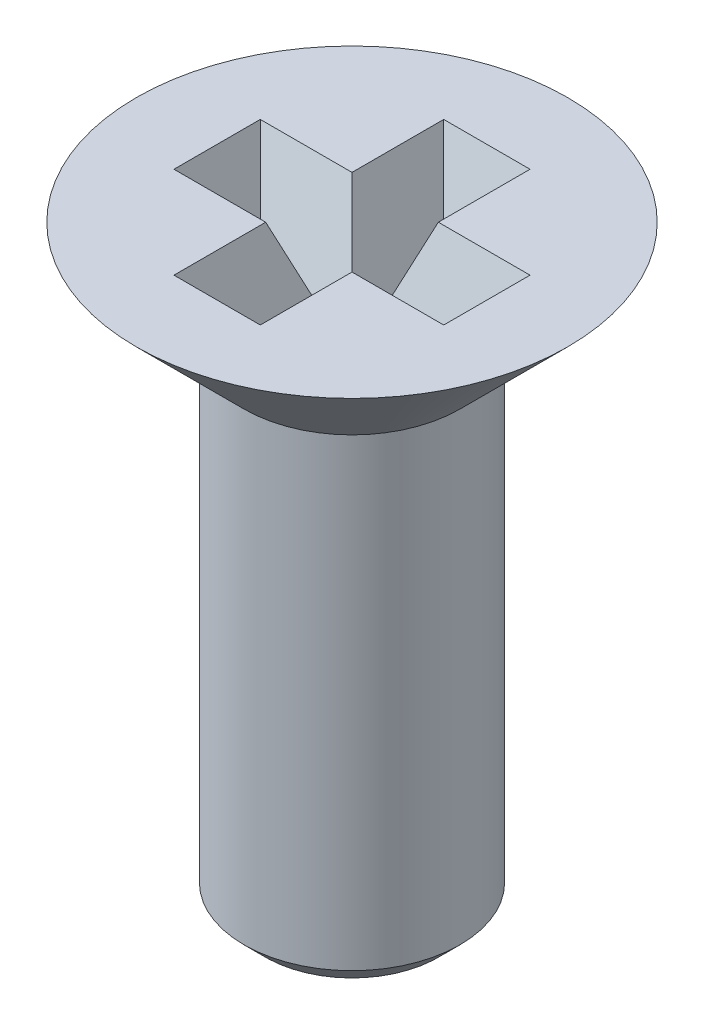
ISO-10303-21;
HEADER;
FILE_DESCRIPTION(('STEP AP214'),'2;1');
FILE_NAME('part.step','',(''),(''),'','','');
FILE_SCHEMA(('AUTOMOTIVE_DESIGN { 1 0 10303 214 1 1 1 1 }'));
ENDSEC;
DATA;
#1=APPLICATION_CONTEXT('core data for automotive mechanical design processes');
#2=APPLICATION_PROTOCOL_DEFINITION('international standard','automotive_design',2000,#1);
#3=PRODUCT_CONTEXT('',#1,'mechanical');
#4=PRODUCT('Part','Part','',(#3));
#5=PRODUCT_RELATED_PRODUCT_CATEGORY('part','',(#4));
#6=PRODUCT_DEFINITION_FORMATION('','',#4);
#7=PRODUCT_DEFINITION_CONTEXT('part definition',#1,'design');
#8=PRODUCT_DEFINITION('design','',#6,#7);
#9=PRODUCT_DEFINITION_SHAPE('','',#8);
#10=(LENGTH_UNIT() NAMED_UNIT(*) SI_UNIT(.MILLI.,.METRE.));
#11=(NAMED_UNIT(*) PLANE_ANGLE_UNIT() SI_UNIT($,.RADIAN.));
#12=(NAMED_UNIT(*) SI_UNIT($,.STERADIAN.) SOLID_ANGLE_UNIT());
#13=UNCERTAINTY_MEASURE_WITH_UNIT(LENGTH_MEASURE(1.E-05),#10,'distance_accuracy_value','');
#14=(GEOMETRIC_REPRESENTATION_CONTEXT(3) GLOBAL_UNCERTAINTY_ASSIGNED_CONTEXT((#13)) GLOBAL_UNIT_ASSIGNED_CONTEXT((#10,
#11,#12)) REPRESENTATION_CONTEXT('',''));
#15=CARTESIAN_POINT('',(0.,0.,0.));
#16=DIRECTION('',(0.,0.,1.));
#17=DIRECTION('',(1.,0.,0.));
#18=AXIS2_PLACEMENT_3D('',#15,#16,#17);
#19=CARTESIAN_POINT('',(-1.25,5.5,0.4));
#20=DIRECTION('',(0.,-0.342020143325669,0.939692620785908));
#21=DIRECTION('',(0.,-0.939692620785908,-0.342020143325669));
#22=AXIS2_PLACEMENT_3D('',#19,#20,#21);
#23=PLANE('',#22);
#24=DIRECTION('',(1.,0.,0.));
#25=VECTOR('',#24,1.);
#26=CARTESIAN_POINT('',(-1.25,4.5,0.0360297657337968));
#27=LINE('',#26,#25);
#28=CARTESIAN_POINT('',(0.0360297657337975,4.5,0.0360297657337968));
#29=VERTEX_POINT('',#28);
#30=CARTESIAN_POINT('',(0.886029765733797,4.5,0.0360297657337968));
#31=VERTEX_POINT('',#30);
#32=EDGE_CURVE('E218',#29,#31,#27,.T.);
#33=ORIENTED_EDGE('',*,*,#32,.F.);
#34=DIRECTION('',(0.323615577118186,0.889126490715988,0.323615577118185));
#35=VECTOR('',#34,1.);
#36=CARTESIAN_POINT('',(0.227200381106666,5.0252369490002,0.227200381106665));
#37=LINE('',#36,#35);
#38=CARTESIAN_POINT('',(0.400000000000002,5.5,0.4));
#39=VERTEX_POINT('',#38);
#40=EDGE_CURVE('E184',#29,#39,#37,.T.);
#41=ORIENTED_EDGE('',*,*,#40,.T.);
#42=DIRECTION('',(1.,0.,0.));
#43=VECTOR('',#42,1.);
#44=CARTESIAN_POINT('',(-1.25,5.5,0.4));
#45=LINE('',#44,#43);
#46=CARTESIAN_POINT('',(1.25,5.5,0.4));
#47=VERTEX_POINT('',#46);
#48=EDGE_CURVE('E195',#39,#47,#45,.T.);
#49=ORIENTED_EDGE('',*,*,#48,.T.);
#50=DIRECTION('',(0.323615577118185,0.889126490715988,0.323615577118185));
#51=VECTOR('',#50,1.);
#52=CARTESIAN_POINT('',(0.98818239561616,4.7806620439397,0.13818239561616));
#53=LINE('',#52,#51);
#54=EDGE_CURVE('E200',#31,#47,#53,.T.);
#55=ORIENTED_EDGE('',*,*,#54,.F.);
#56=EDGE_LOOP('',(#33,#41,#49,#55));
#57=FACE_BOUND('',#56,.T.);
#58=ADVANCED_FACE('F40',(#57),#23,.F.);
#59=CARTESIAN_POINT('',(-1.25,5.5,-0.4));
#60=DIRECTION('',(0.,-0.342020143325669,-0.939692620785908));
#61=DIRECTION('',(0.,0.939692620785908,-0.342020143325669));
#62=AXIS2_PLACEMENT_3D('',#59,#60,#61);
#63=PLANE('',#62);
#64=DIRECTION('',(-1.,0.,0.));
#65=VECTOR('',#64,1.);
#66=CARTESIAN_POINT('',(-1.25,5.5,-0.4));
#67=LINE('',#66,#65);
#68=CARTESIAN_POINT('',(1.25,5.5,-0.4));
#69=VERTEX_POINT('',#68);
#70=CARTESIAN_POINT('',(0.399999999999999,5.5,-0.4));
#71=VERTEX_POINT('',#70);
#72=EDGE_CURVE('E189',#69,#71,#67,.T.);
#73=ORIENTED_EDGE('',*,*,#72,.T.);
#74=DIRECTION('',(-0.323615577118184,-0.889126490715988,0.323615577118185));
#75=VECTOR('',#74,1.);
#76=CARTESIAN_POINT('',(0.227200381106666,5.0252369490002,-0.227200381106666));
#77=LINE('',#76,#75);
#78=CARTESIAN_POINT('',(0.0360297657337972,4.5,-0.0360297657337968));
#79=VERTEX_POINT('',#78);
#80=EDGE_CURVE('E181',#71,#79,#77,.T.);
#81=ORIENTED_EDGE('',*,*,#80,.T.);
#82=DIRECTION('',(-1.,0.,0.));
#83=VECTOR('',#82,1.);
#84=CARTESIAN_POINT('',(-1.25,4.5,-0.0360297657337968));
#85=LINE('',#84,#83);
#86=CARTESIAN_POINT('',(0.886029765733797,4.5,-0.0360297657337968));
#87=VERTEX_POINT('',#86);
#88=EDGE_CURVE('E222',#87,#79,#85,.T.);
#89=ORIENTED_EDGE('',*,*,#88,.F.);
#90=DIRECTION('',(0.323615577118185,0.889126490715988,-0.323615577118185));
#91=VECTOR('',#90,1.);
#92=CARTESIAN_POINT('',(1.16621836659717,5.2698118540607,-0.316218366597171));
#93=LINE('',#92,#91);
#94=EDGE_CURVE('E205',#87,#69,#93,.T.);
#95=ORIENTED_EDGE('',*,*,#94,.T.);
#96=EDGE_LOOP('',(#73,#81,#89,#95));
#97=FACE_BOUND('',#96,.T.);
#98=ADVANCED_FACE('F249',(#97),#63,.F.);
#99=CARTESIAN_POINT('',(0.,0.,0.));
#100=DIRECTION('',(0.,1.,0.));
#101=DIRECTION('',(-1.,0.,0.));
#102=AXIS2_PLACEMENT_3D('',#99,#100,#101);
#103=PLANE('',#102);
#104=CARTESIAN_POINT('',(0.,0.,0.));
#105=DIRECTION('',(0.,1.,0.));
#106=DIRECTION('',(-1.,0.,0.));
#107=AXIS2_PLACEMENT_3D('',#104,#105,#106);
#108=CIRCLE('',#107,0.800000000000001);
#109=CARTESIAN_POINT('',(-0.800000000000001,0.,0.));
#110=VERTEX_POINT('',#109);
#111=EDGE_CURVE('E11',#110,#110,#108,.F.);
#112=ORIENTED_EDGE('',*,*,#111,.T.);
#113=EDGE_LOOP('',(#112));
#114=FACE_BOUND('',#113,.T.);
#115=ADVANCED_FACE('F255',(#114),#103,.F.);
#116=CARTESIAN_POINT('',(0.,5.5,0.));
#117=DIRECTION('',(0.,1.,0.));
#118=DIRECTION('',(-1.,0.,0.));
#119=AXIS2_PLACEMENT_3D('',#116,#117,#118);
#120=CYLINDRICAL_SURFACE('',#119,1.);
#121=CARTESIAN_POINT('',(0.,0.199999999999999,0.));
#122=DIRECTION('',(0.,1.,0.));
#123=DIRECTION('',(-1.,0.,0.));
#124=AXIS2_PLACEMENT_3D('',#121,#122,#123);
#125=CIRCLE('',#124,1.);
#126=CARTESIAN_POINT('',(-1.,0.199999999999999,0.));
#127=VERTEX_POINT('',#126);
#128=EDGE_CURVE('E49',#127,#127,#125,.T.);
#129=ORIENTED_EDGE('',*,*,#128,.T.);
#130=EDGE_LOOP('',(#129));
#131=FACE_BOUND('',#130,.T.);
#132=CARTESIAN_POINT('',(0.,4.5,0.));
#133=DIRECTION('',(0.,1.,0.));
#134=DIRECTION('',(-1.,0.,0.));
#135=AXIS2_PLACEMENT_3D('',#132,#133,#134);
#136=CIRCLE('',#135,1.);
#137=CARTESIAN_POINT('',(-1.,4.5,0.));
#138=VERTEX_POINT('',#137);
#139=EDGE_CURVE('E227',#138,#138,#136,.T.);
#140=ORIENTED_EDGE('',*,*,#139,.F.);
#141=EDGE_LOOP('',(#140));
#142=FACE_BOUND('',#141,.T.);
#143=ADVANCED_FACE('F232',(#131,#142),#120,.T.);
#144=CARTESIAN_POINT('',(0.,4.5,0.));
#145=DIRECTION('',(0.,1.,0.));
#146=DIRECTION('',(-1.,0.,0.));
#147=AXIS2_PLACEMENT_3D('',#144,#145,#146);
#148=CONICAL_SURFACE('',#147,1.,0.785398163397451);
#149=CARTESIAN_POINT('',(0.,5.5,0.));
#150=DIRECTION('',(0.,1.,0.));
#151=DIRECTION('',(-1.,0.,0.));
#152=AXIS2_PLACEMENT_3D('',#149,#150,#151);
#153=CIRCLE('',#152,2.);
#154=CARTESIAN_POINT('',(-2.,5.5,0.));
#155=VERTEX_POINT('',#154);
#156=EDGE_CURVE('E203',#155,#155,#153,.T.);
#157=ORIENTED_EDGE('',*,*,#156,.F.);
#158=EDGE_LOOP('',(#157));
#159=FACE_BOUND('',#158,.T.);
#160=ORIENTED_EDGE('',*,*,#139,.T.);
#161=EDGE_LOOP('',(#160));
#162=FACE_BOUND('',#161,.T.);
#163=ADVANCED_FACE('F245',(#159,#162),#148,.T.);
#164=CARTESIAN_POINT('',(2.,5.5,0.));
#165=DIRECTION('',(0.,-1.,0.));
#166=DIRECTION('',(1.,0.,0.));
#167=AXIS2_PLACEMENT_3D('',#164,#165,#166);
#168=PLANE('',#167);
#169=ORIENTED_EDGE('',*,*,#48,.F.);
#170=DIRECTION('',(0.,0.,-1.));
#171=VECTOR('',#170,1.);
#172=CARTESIAN_POINT('',(0.400000000000005,5.5,1.25));
#173=LINE('',#172,#171);
#174=CARTESIAN_POINT('',(0.400000000000005,5.5,1.25));
#175=VERTEX_POINT('',#174);
#176=EDGE_CURVE('E161',#175,#39,#173,.T.);
#177=ORIENTED_EDGE('',*,*,#176,.F.);
#178=DIRECTION('',(1.,0.,0.));
#179=VECTOR('',#178,1.);
#180=CARTESIAN_POINT('',(0.400000000000005,5.5,1.25));
#181=LINE('',#180,#179);
#182=CARTESIAN_POINT('',(-0.399999999999995,5.5,1.25));
#183=VERTEX_POINT('',#182);
#184=EDGE_CURVE('E155',#183,#175,#181,.T.);
#185=ORIENTED_EDGE('',*,*,#184,.F.);
#186=DIRECTION('',(0.,0.,1.));
#187=VECTOR('',#186,1.);
#188=CARTESIAN_POINT('',(-0.399999999999995,5.5,1.25));
#189=LINE('',#188,#187);
#190=CARTESIAN_POINT('',(-0.399999999999998,5.5,0.4));
#191=VERTEX_POINT('',#190);
#192=EDGE_CURVE('E147',#191,#183,#189,.T.);
#193=ORIENTED_EDGE('',*,*,#192,.F.);
#194=CARTESIAN_POINT('',(-1.25,5.5,0.4));
#195=VERTEX_POINT('',#194);
#196=EDGE_CURVE('E196',#195,#191,#45,.T.);
#197=ORIENTED_EDGE('',*,*,#196,.F.);
#198=DIRECTION('',(0.,0.,1.));
#199=VECTOR('',#198,1.);
#200=CARTESIAN_POINT('',(-1.25,5.5,0.4));
#201=LINE('',#200,#199);
#202=CARTESIAN_POINT('',(-1.25,5.5,-0.4));
#203=VERTEX_POINT('',#202);
#204=EDGE_CURVE('E192',#203,#195,#201,.T.);
#205=ORIENTED_EDGE('',*,*,#204,.F.);
#206=CARTESIAN_POINT('',(-0.400000000000001,5.5,-0.4));
#207=VERTEX_POINT('',#206);
#208=EDGE_CURVE('E154',#207,#203,#67,.T.);
#209=ORIENTED_EDGE('',*,*,#208,.F.);
#210=CARTESIAN_POINT('',(-0.400000000000004,5.5,-1.25));
#211=VERTEX_POINT('',#210);
#212=EDGE_CURVE('E133',#211,#207,#189,.T.);
#213=ORIENTED_EDGE('',*,*,#212,.F.);
#214=DIRECTION('',(-1.,0.,0.));
#215=VECTOR('',#214,1.);
#216=CARTESIAN_POINT('',(0.399999999999996,5.5,-1.25));
#217=LINE('',#216,#215);
#218=CARTESIAN_POINT('',(0.399999999999996,5.5,-1.25));
#219=VERTEX_POINT('',#218);
#220=EDGE_CURVE('E141',#219,#211,#217,.T.);
#221=ORIENTED_EDGE('',*,*,#220,.F.);
#222=EDGE_CURVE('E158',#71,#219,#173,.T.);
#223=ORIENTED_EDGE('',*,*,#222,.F.);
#224=ORIENTED_EDGE('',*,*,#72,.F.);
#225=DIRECTION('',(0.,0.,-1.));
#226=VECTOR('',#225,1.);
#227=CARTESIAN_POINT('',(1.25,5.5,0.4));
#228=LINE('',#227,#226);
#229=EDGE_CURVE('E187',#47,#69,#228,.T.);
#230=ORIENTED_EDGE('',*,*,#229,.F.);
#231=EDGE_LOOP('',(#169,#177,#185,#193,#197,#205,#209,#213,#221,#223,#224,#230));
#232=FACE_BOUND('',#231,.T.);
#233=ORIENTED_EDGE('',*,*,#156,.T.);
#234=EDGE_LOOP('',(#233));
#235=FACE_BOUND('',#234,.T.);
#236=ADVANCED_FACE('F151',(#232,#235),#168,.F.);
#237=CARTESIAN_POINT('',(0.,0.199999999999999,0.));
#238=DIRECTION('',(0.,1.,0.));
#239=DIRECTION('',(-1.,0.,0.));
#240=AXIS2_PLACEMENT_3D('',#237,#238,#239);
#241=CONICAL_SURFACE('',#240,1.,0.78539816339745);
#242=ORIENTED_EDGE('',*,*,#111,.F.);
#243=EDGE_LOOP('',(#242));
#244=FACE_BOUND('',#243,.T.);
#245=ORIENTED_EDGE('',*,*,#128,.F.);
#246=EDGE_LOOP('',(#245));
#247=FACE_BOUND('',#246,.T.);
#248=ADVANCED_FACE('F43',(#244,#247),#241,.T.);
#249=CARTESIAN_POINT('',(1.25,5.5,0.4));
#250=DIRECTION('',(0.939692620785908,-0.34202014332567,0.));
#251=DIRECTION('',(0.34202014332567,0.939692620785908,0.));
#252=AXIS2_PLACEMENT_3D('',#249,#250,#251);
#253=PLANE('',#252);
#254=ORIENTED_EDGE('',*,*,#229,.T.);
#255=ORIENTED_EDGE('',*,*,#94,.F.);
#256=DIRECTION('',(0.,0.,-1.));
#257=VECTOR('',#256,1.);
#258=CARTESIAN_POINT('',(0.886029765733797,4.5,0.4));
#259=LINE('',#258,#257);
#260=EDGE_CURVE('E199',#31,#87,#259,.T.);
#261=ORIENTED_EDGE('',*,*,#260,.F.);
#262=ORIENTED_EDGE('',*,*,#54,.T.);
#263=EDGE_LOOP('',(#254,#255,#261,#262));
#264=FACE_BOUND('',#263,.T.);
#265=ADVANCED_FACE('F236',(#264),#253,.F.);
#266=ORIENTED_EDGE('',*,*,#196,.T.);
#267=DIRECTION('',(0.323615577118184,-0.889126490715988,-0.323615577118185));
#268=VECTOR('',#267,1.);
#269=CARTESIAN_POINT('',(-0.489017985490503,5.7445749050605,0.489017985490506));
#270=LINE('',#269,#268);
#271=CARTESIAN_POINT('',(-0.0360297657337959,4.5,0.0360297657337968));
#272=VERTEX_POINT('',#271);
#273=EDGE_CURVE('E178',#191,#272,#270,.T.);
#274=ORIENTED_EDGE('',*,*,#273,.T.);
#275=CARTESIAN_POINT('',(-0.886029765733797,4.5,0.0360297657337968));
#276=VERTEX_POINT('',#275);
#277=EDGE_CURVE('E209',#276,#272,#27,.T.);
#278=ORIENTED_EDGE('',*,*,#277,.F.);
#279=DIRECTION('',(-0.323615577118185,0.889126490715988,0.323615577118185));
#280=VECTOR('',#279,1.);
#281=CARTESIAN_POINT('',(-1.25,5.5,0.4));
#282=LINE('',#281,#280);
#283=EDGE_CURVE('E204',#276,#195,#282,.T.);
#284=ORIENTED_EDGE('',*,*,#283,.T.);
#285=EDGE_LOOP('',(#266,#274,#278,#284));
#286=FACE_BOUND('',#285,.T.);
#287=ADVANCED_FACE('F242',(#286),#23,.F.);
#288=CARTESIAN_POINT('',(-1.25,5.5,0.4));
#289=DIRECTION('',(-0.939692620785908,-0.342020143325669,0.));
#290=DIRECTION('',(0.342020143325669,-0.939692620785908,0.));
#291=AXIS2_PLACEMENT_3D('',#288,#289,#290);
#292=PLANE('',#291);
#293=ORIENTED_EDGE('',*,*,#204,.T.);
#294=ORIENTED_EDGE('',*,*,#283,.F.);
#295=DIRECTION('',(0.,0.,1.));
#296=VECTOR('',#295,1.);
#297=CARTESIAN_POINT('',(-0.886029765733797,4.5,0.4));
#298=LINE('',#297,#296);
#299=CARTESIAN_POINT('',(-0.886029765733797,4.5,-0.0360297657337968));
#300=VERTEX_POINT('',#299);
#301=EDGE_CURVE('E219',#300,#276,#298,.T.);
#302=ORIENTED_EDGE('',*,*,#301,.F.);
#303=DIRECTION('',(-0.323615577118185,0.889126490715988,-0.323615577118185));
#304=VECTOR('',#303,1.);
#305=CARTESIAN_POINT('',(-1.25,5.5,-0.4));
#306=LINE('',#305,#304);
#307=EDGE_CURVE('E208',#300,#203,#306,.T.);
#308=ORIENTED_EDGE('',*,*,#307,.T.);
#309=EDGE_LOOP('',(#293,#294,#302,#308));
#310=FACE_BOUND('',#309,.T.);
#311=ADVANCED_FACE('F262',(#310),#292,.F.);
#312=CARTESIAN_POINT('',(-0.036029765733796,4.5,-0.0360297657337968));
#313=VERTEX_POINT('',#312);
#314=EDGE_CURVE('E215',#313,#300,#85,.T.);
#315=ORIENTED_EDGE('',*,*,#314,.F.);
#316=DIRECTION('',(-0.323615577118186,0.889126490715988,-0.323615577118185));
#317=VECTOR('',#316,1.);
#318=CARTESIAN_POINT('',(-0.489017985490507,5.7445749050605,-0.489017985490506));
#319=LINE('',#318,#317);
#320=EDGE_CURVE('E164',#313,#207,#319,.T.);
#321=ORIENTED_EDGE('',*,*,#320,.T.);
#322=ORIENTED_EDGE('',*,*,#208,.T.);
#323=ORIENTED_EDGE('',*,*,#307,.F.);
#324=EDGE_LOOP('',(#315,#321,#322,#323));
#325=FACE_BOUND('',#324,.T.);
#326=ADVANCED_FACE('F258',(#325),#63,.F.);
#327=CARTESIAN_POINT('',(0.,4.5,0.));
#328=DIRECTION('',(0.,-1.,0.));
#329=DIRECTION('',(0.,0.,-1.));
#330=AXIS2_PLACEMENT_3D('',#327,#328,#329);
#331=PLANE('',#330);
#332=ORIENTED_EDGE('',*,*,#277,.T.);
#333=DIRECTION('',(0.,0.,1.));
#334=VECTOR('',#333,1.);
#335=CARTESIAN_POINT('',(-0.0360297657337917,4.5,1.25));
#336=LINE('',#335,#334);
#337=CARTESIAN_POINT('',(-0.036029765733793,4.5,0.886029765733798));
#338=VERTEX_POINT('',#337);
#339=EDGE_CURVE('E171',#272,#338,#336,.T.);
#340=ORIENTED_EDGE('',*,*,#339,.T.);
#341=DIRECTION('',(1.,0.,0.));
#342=VECTOR('',#341,1.);
#343=CARTESIAN_POINT('',(0.400000000000004,4.5,0.886029765733796));
#344=LINE('',#343,#342);
#345=CARTESIAN_POINT('',(0.0360297657338005,4.5,0.886029765733797));
#346=VERTEX_POINT('',#345);
#347=EDGE_CURVE('E174',#338,#346,#344,.T.);
#348=ORIENTED_EDGE('',*,*,#347,.T.);
#349=DIRECTION('',(0.,0.,-1.));
#350=VECTOR('',#349,1.);
#351=CARTESIAN_POINT('',(0.0360297657338017,4.5,1.25));
#352=LINE('',#351,#350);
#353=EDGE_CURVE('E56',#346,#29,#352,.T.);
#354=ORIENTED_EDGE('',*,*,#353,.T.);
#355=ORIENTED_EDGE('',*,*,#32,.T.);
#356=ORIENTED_EDGE('',*,*,#260,.T.);
#357=ORIENTED_EDGE('',*,*,#88,.T.);
#358=CARTESIAN_POINT('',(0.0360297657337943,4.5,-0.886029765733796));
#359=VERTEX_POINT('',#358);
#360=EDGE_CURVE('E173',#79,#359,#352,.T.);
#361=ORIENTED_EDGE('',*,*,#360,.T.);
#362=DIRECTION('',(-1.,0.,0.));
#363=VECTOR('',#362,1.);
#364=CARTESIAN_POINT('',(0.399999999999998,4.5,-0.886029765733798));
#365=LINE('',#364,#363);
#366=CARTESIAN_POINT('',(-0.0360297657337992,4.5,-0.886029765733796));
#367=VERTEX_POINT('',#366);
#368=EDGE_CURVE('E163',#359,#367,#365,.T.);
#369=ORIENTED_EDGE('',*,*,#368,.T.);
#370=EDGE_CURVE('E63',#367,#313,#336,.T.);
#371=ORIENTED_EDGE('',*,*,#370,.T.);
#372=ORIENTED_EDGE('',*,*,#314,.T.);
#373=ORIENTED_EDGE('',*,*,#301,.T.);
#374=EDGE_LOOP('',(#332,#340,#348,#354,#355,#356,#357,#361,#369,#371,#372,#373));
#375=FACE_BOUND('',#374,.T.);
#376=ADVANCED_FACE('F279',(#375),#331,.F.);
#377=CARTESIAN_POINT('',(-0.399999999999995,5.5,1.25));
#378=DIRECTION('',(-0.939692620785908,-0.342020143325669,0.));
#379=DIRECTION('',(0.342020143325669,-0.939692620785908,0.));
#380=AXIS2_PLACEMENT_3D('',#377,#378,#379);
#381=PLANE('',#380);
#382=ORIENTED_EDGE('',*,*,#370,.F.);
#383=DIRECTION('',(-0.323615577118186,0.889126490715988,-0.323615577118184));
#384=VECTOR('',#383,1.);
#385=CARTESIAN_POINT('',(-0.316218366597174,5.2698118540607,-1.16621836659717));
#386=LINE('',#385,#384);
#387=EDGE_CURVE('E129',#367,#211,#386,.T.);
#388=ORIENTED_EDGE('',*,*,#387,.T.);
#389=ORIENTED_EDGE('',*,*,#212,.T.);
#390=ORIENTED_EDGE('',*,*,#320,.F.);
#391=EDGE_LOOP('',(#382,#388,#389,#390));
#392=FACE_BOUND('',#391,.T.);
#393=ADVANCED_FACE('F131',(#392),#381,.F.);
#394=CARTESIAN_POINT('',(0.400000000000005,5.5,1.25));
#395=DIRECTION('',(0.939692620785908,-0.34202014332567,0.));
#396=DIRECTION('',(0.34202014332567,0.939692620785908,0.));
#397=AXIS2_PLACEMENT_3D('',#394,#395,#396);
#398=PLANE('',#397);
#399=ORIENTED_EDGE('',*,*,#222,.T.);
#400=DIRECTION('',(0.323615577118184,0.889126490715988,-0.323615577118186));
#401=VECTOR('',#400,1.);
#402=CARTESIAN_POINT('',(0.138182395616157,4.7806620439397,-0.988182395616159));
#403=LINE('',#402,#401);
#404=EDGE_CURVE('E144',#359,#219,#403,.T.);
#405=ORIENTED_EDGE('',*,*,#404,.F.);
#406=ORIENTED_EDGE('',*,*,#360,.F.);
#407=ORIENTED_EDGE('',*,*,#80,.F.);
#408=EDGE_LOOP('',(#399,#405,#406,#407));
#409=FACE_BOUND('',#408,.T.);
#410=ADVANCED_FACE('F288',(#409),#398,.F.);
#411=CARTESIAN_POINT('',(0.399999999999996,5.5,-1.25));
#412=DIRECTION('',(0.,-0.342020143325669,-0.939692620785908));
#413=DIRECTION('',(0.,0.939692620785908,-0.342020143325669));
#414=AXIS2_PLACEMENT_3D('',#411,#412,#413);
#415=PLANE('',#414);
#416=ORIENTED_EDGE('',*,*,#220,.T.);
#417=ORIENTED_EDGE('',*,*,#387,.F.);
#418=ORIENTED_EDGE('',*,*,#368,.F.);
#419=ORIENTED_EDGE('',*,*,#404,.T.);
#420=EDGE_LOOP('',(#416,#417,#418,#419));
#421=FACE_BOUND('',#420,.T.);
#422=ADVANCED_FACE('F142',(#421),#415,.F.);
#423=ORIENTED_EDGE('',*,*,#353,.F.);
#424=DIRECTION('',(0.323615577118186,0.889126490715988,0.323615577118184));
#425=VECTOR('',#424,1.);
#426=CARTESIAN_POINT('',(0.400000000000005,5.5,1.25));
#427=LINE('',#426,#425);
#428=EDGE_CURVE('E165',#346,#175,#427,.T.);
#429=ORIENTED_EDGE('',*,*,#428,.T.);
#430=ORIENTED_EDGE('',*,*,#176,.T.);
#431=ORIENTED_EDGE('',*,*,#40,.F.);
#432=EDGE_LOOP('',(#423,#429,#430,#431));
#433=FACE_BOUND('',#432,.T.);
#434=ADVANCED_FACE('F281',(#433),#398,.F.);
#435=ORIENTED_EDGE('',*,*,#192,.T.);
#436=DIRECTION('',(-0.323615577118184,0.889126490715988,0.323615577118186));
#437=VECTOR('',#436,1.);
#438=CARTESIAN_POINT('',(-0.399999999999995,5.5,1.25));
#439=LINE('',#438,#437);
#440=EDGE_CURVE('E137',#338,#183,#439,.T.);
#441=ORIENTED_EDGE('',*,*,#440,.F.);
#442=ORIENTED_EDGE('',*,*,#339,.F.);
#443=ORIENTED_EDGE('',*,*,#273,.F.);
#444=EDGE_LOOP('',(#435,#441,#442,#443));
#445=FACE_BOUND('',#444,.T.);
#446=ADVANCED_FACE('F275',(#445),#381,.F.);
#447=CARTESIAN_POINT('',(0.400000000000005,5.5,1.25));
#448=DIRECTION('',(0.,-0.342020143325669,0.939692620785908));
#449=DIRECTION('',(0.,-0.939692620785908,-0.342020143325669));
#450=AXIS2_PLACEMENT_3D('',#447,#448,#449);
#451=PLANE('',#450);
#452=ORIENTED_EDGE('',*,*,#184,.T.);
#453=ORIENTED_EDGE('',*,*,#428,.F.);
#454=ORIENTED_EDGE('',*,*,#347,.F.);
#455=ORIENTED_EDGE('',*,*,#440,.T.);
#456=EDGE_LOOP('',(#452,#453,#454,#455));
#457=FACE_BOUND('',#456,.T.);
#458=ADVANCED_FACE('F278',(#457),#451,.F.);
#459=CLOSED_SHELL('',(#58,#98,#115,#143,#163,#236,#248,#265,#287,#311,#326,#376,#393,#410,#422,
#434,#446,#458));
#460=MANIFOLD_SOLID_BREP('B2',#459);
#461=ADVANCED_BREP_SHAPE_REPRESENTATION('',(#18,#460),#14);
#462=SHAPE_DEFINITION_REPRESENTATION(#9,#461);
ENDSEC;
END-ISO-10303-21;
